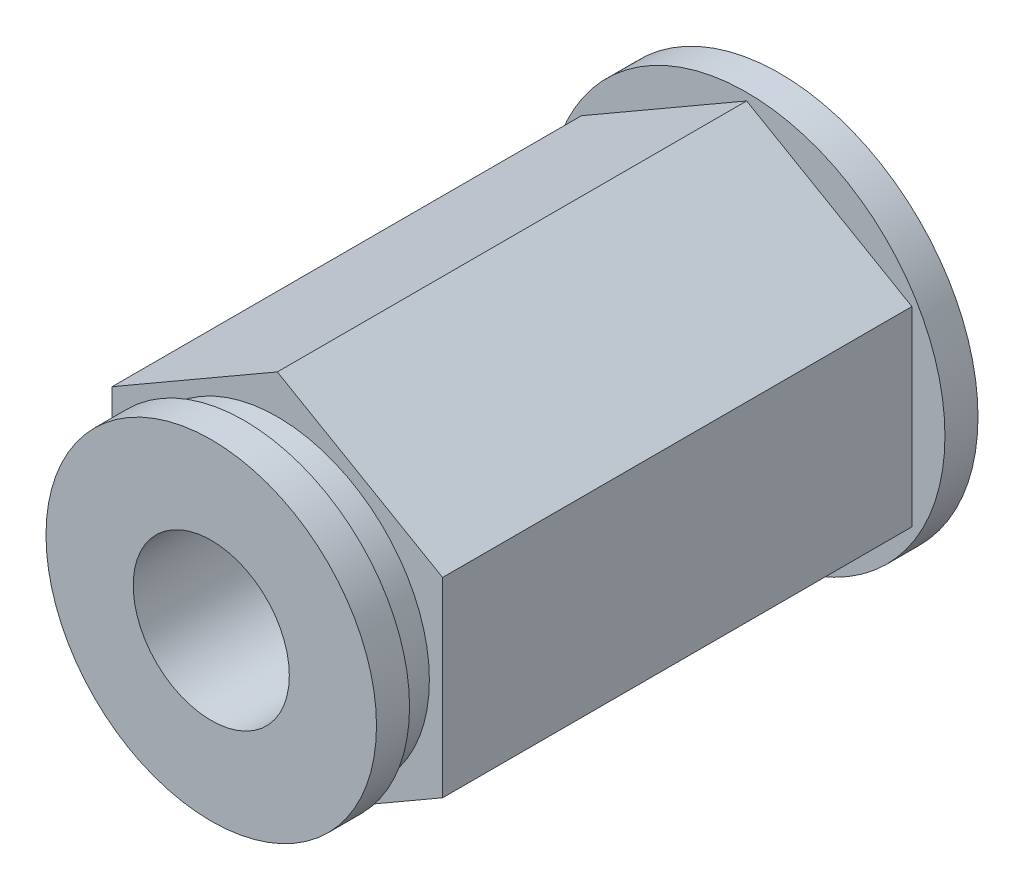
ISO-10303-21;
HEADER;
FILE_DESCRIPTION(('STEP AP214'),'2;1');
FILE_NAME('part.step','',(''),(''),'','','');
FILE_SCHEMA(('AUTOMOTIVE_DESIGN { 1 0 10303 214 1 1 1 1 }'));
ENDSEC;
DATA;
#1=APPLICATION_CONTEXT('core data for automotive mechanical design processes');
#2=APPLICATION_PROTOCOL_DEFINITION('international standard','automotive_design',2000,#1);
#3=PRODUCT_CONTEXT('',#1,'mechanical');
#4=PRODUCT('Part','Part','',(#3));
#5=PRODUCT_RELATED_PRODUCT_CATEGORY('part','',(#4));
#6=PRODUCT_DEFINITION_FORMATION('','',#4);
#7=PRODUCT_DEFINITION_CONTEXT('part definition',#1,'design');
#8=PRODUCT_DEFINITION('design','',#6,#7);
#9=PRODUCT_DEFINITION_SHAPE('','',#8);
#10=(LENGTH_UNIT() NAMED_UNIT(*) SI_UNIT(.MILLI.,.METRE.));
#11=(NAMED_UNIT(*) PLANE_ANGLE_UNIT() SI_UNIT($,.RADIAN.));
#12=(NAMED_UNIT(*) SI_UNIT($,.STERADIAN.) SOLID_ANGLE_UNIT());
#13=UNCERTAINTY_MEASURE_WITH_UNIT(LENGTH_MEASURE(1.E-05),#10,'distance_accuracy_value','');
#14=(GEOMETRIC_REPRESENTATION_CONTEXT(3) GLOBAL_UNCERTAINTY_ASSIGNED_CONTEXT((#13)) GLOBAL_UNIT_ASSIGNED_CONTEXT((#10,
#11,#12)) REPRESENTATION_CONTEXT('',''));
#15=CARTESIAN_POINT('',(0.,0.,0.));
#16=DIRECTION('',(0.,0.,1.));
#17=DIRECTION('',(1.,0.,0.));
#18=AXIS2_PLACEMENT_3D('',#15,#16,#17);
#19=CARTESIAN_POINT('',(0.,0.,0.));
#20=DIRECTION('',(0.,0.,1.));
#21=DIRECTION('',(1.,0.,0.));
#22=AXIS2_PLACEMENT_3D('',#19,#20,#21);
#23=PLANE('',#22);
#24=CARTESIAN_POINT('',(0.,0.,0.));
#25=DIRECTION('',(0.,0.,1.));
#26=DIRECTION('',(1.,0.,0.));
#27=AXIS2_PLACEMENT_3D('',#24,#25,#26);
#28=CIRCLE('',#27,7.62);
#29=CARTESIAN_POINT('',(7.62,0.,0.));
#30=VERTEX_POINT('',#29);
#31=EDGE_CURVE('E145',#30,#30,#28,.T.);
#32=ORIENTED_EDGE('',*,*,#31,.F.);
#33=EDGE_LOOP('',(#32));
#34=FACE_BOUND('',#33,.T.);
#35=CARTESIAN_POINT('',(0.,0.,0.));
#36=DIRECTION('',(0.,0.,1.));
#37=DIRECTION('',(1.,0.,0.));
#38=AXIS2_PLACEMENT_3D('',#35,#36,#37);
#39=CIRCLE('',#38,3.);
#40=CARTESIAN_POINT('',(3.,0.,0.));
#41=VERTEX_POINT('',#40);
#42=EDGE_CURVE('E163',#41,#41,#39,.T.);
#43=ORIENTED_EDGE('',*,*,#42,.T.);
#44=EDGE_LOOP('',(#43));
#45=FACE_BOUND('',#44,.T.);
#46=ADVANCED_FACE('F32',(#34,#45),#23,.F.);
#47=CARTESIAN_POINT('',(0.,0.,21.844));
#48=DIRECTION('',(0.,0.,1.));
#49=DIRECTION('',(1.,0.,0.));
#50=AXIS2_PLACEMENT_3D('',#47,#48,#49);
#51=PLANE('',#50);
#52=CARTESIAN_POINT('',(0.,0.,21.844));
#53=DIRECTION('',(0.,0.,1.));
#54=DIRECTION('',(1.,0.,0.));
#55=AXIS2_PLACEMENT_3D('',#52,#53,#54);
#56=CIRCLE('',#55,6.35);
#57=CARTESIAN_POINT('',(-6.35,0.,21.844));
#58=VERTEX_POINT('',#57);
#59=EDGE_CURVE('E154',#58,#58,#56,.T.);
#60=ORIENTED_EDGE('',*,*,#59,.T.);
#61=EDGE_LOOP('',(#60));
#62=FACE_BOUND('',#61,.T.);
#63=CARTESIAN_POINT('',(0.,0.,21.844));
#64=DIRECTION('',(0.,0.,1.));
#65=DIRECTION('',(1.,0.,0.));
#66=AXIS2_PLACEMENT_3D('',#63,#64,#65);
#67=CIRCLE('',#66,3.);
#68=CARTESIAN_POINT('',(3.,0.,21.844));
#69=VERTEX_POINT('',#68);
#70=EDGE_CURVE('E160',#69,#69,#67,.T.);
#71=ORIENTED_EDGE('',*,*,#70,.F.);
#72=EDGE_LOOP('',(#71));
#73=FACE_BOUND('',#72,.T.);
#74=ADVANCED_FACE('F172',(#62,#73),#51,.T.);
#75=CARTESIAN_POINT('',(0.,0.,19.304));
#76=DIRECTION('',(0.,0.,1.));
#77=DIRECTION('',(1.,0.,0.));
#78=AXIS2_PLACEMENT_3D('',#75,#76,#77);
#79=PLANE('',#78);
#80=DIRECTION('',(-0.866025403784441,0.499999999999995,0.));
#81=VECTOR('',#80,1.);
#82=CARTESIAN_POINT('',(6.34999999999996,3.6661742093542,19.304));
#83=LINE('',#82,#81);
#84=CARTESIAN_POINT('',(6.34999999999996,3.6661742093542,19.304));
#85=VERTEX_POINT('',#84);
#86=CARTESIAN_POINT('',(0.,7.33234841870825,19.304));
#87=VERTEX_POINT('',#86);
#88=EDGE_CURVE('E122',#85,#87,#83,.T.);
#89=ORIENTED_EDGE('',*,*,#88,.T.);
#90=DIRECTION('',(-0.866025403784438,-0.500000000000001,0.));
#91=VECTOR('',#90,1.);
#92=CARTESIAN_POINT('',(0.,7.33234841870825,19.304));
#93=LINE('',#92,#91);
#94=CARTESIAN_POINT('',(-6.35000000000001,3.66617420935411,19.304));
#95=VERTEX_POINT('',#94);
#96=EDGE_CURVE('E119',#87,#95,#93,.T.);
#97=ORIENTED_EDGE('',*,*,#96,.T.);
#98=DIRECTION('',(0.,-1.,0.));
#99=VECTOR('',#98,1.);
#100=CARTESIAN_POINT('',(-6.35000000000001,3.66617420935411,19.304));
#101=LINE('',#100,#99);
#102=CARTESIAN_POINT('',(-6.34999999999999,-3.66617420935416,19.304));
#103=VERTEX_POINT('',#102);
#104=EDGE_CURVE('E130',#95,#103,#101,.T.);
#105=ORIENTED_EDGE('',*,*,#104,.T.);
#106=DIRECTION('',(0.866025403784442,-0.499999999999995,0.));
#107=VECTOR('',#106,1.);
#108=CARTESIAN_POINT('',(-6.34999999999999,-3.66617420935416,19.304));
#109=LINE('',#108,#107);
#110=CARTESIAN_POINT('',(0.,-7.33234841870825,19.304));
#111=VERTEX_POINT('',#110);
#112=EDGE_CURVE('E132',#103,#111,#109,.T.);
#113=ORIENTED_EDGE('',*,*,#112,.T.);
#114=DIRECTION('',(0.866025403784435,0.500000000000007,0.));
#115=VECTOR('',#114,1.);
#116=CARTESIAN_POINT('',(0.,-7.33234841870825,19.304));
#117=LINE('',#116,#115);
#118=CARTESIAN_POINT('',(6.35000000000004,-3.66617420935407,19.304));
#119=VERTEX_POINT('',#118);
#120=EDGE_CURVE('E134',#111,#119,#117,.T.);
#121=ORIENTED_EDGE('',*,*,#120,.T.);
#122=DIRECTION('',(0.,1.,0.));
#123=VECTOR('',#122,1.);
#124=CARTESIAN_POINT('',(6.35000000000004,-3.66617420935407,19.304));
#125=LINE('',#124,#123);
#126=EDGE_CURVE('E54',#119,#85,#125,.T.);
#127=ORIENTED_EDGE('',*,*,#126,.T.);
#128=EDGE_LOOP('',(#89,#97,#105,#113,#121,#127));
#129=FACE_BOUND('',#128,.T.);
#130=CARTESIAN_POINT('',(0.,0.,19.304));
#131=DIRECTION('',(0.,0.,1.));
#132=DIRECTION('',(1.,0.,0.));
#133=AXIS2_PLACEMENT_3D('',#130,#131,#132);
#134=CIRCLE('',#133,5.842);
#135=CARTESIAN_POINT('',(5.842,0.,19.304));
#136=VERTEX_POINT('',#135);
#137=EDGE_CURVE('E151',#136,#136,#134,.T.);
#138=ORIENTED_EDGE('',*,*,#137,.F.);
#139=EDGE_LOOP('',(#138));
#140=FACE_BOUND('',#139,.T.);
#141=ADVANCED_FACE('F135',(#129,#140),#79,.T.);
#142=CARTESIAN_POINT('',(6.34999999999996,3.6661742093542,19.304));
#143=DIRECTION('',(-0.499999999999995,-0.866025403784441,0.));
#144=DIRECTION('',(0.866025403784441,-0.499999999999995,0.));
#145=AXIS2_PLACEMENT_3D('',#142,#143,#144);
#146=PLANE('',#145);
#147=DIRECTION('',(0.,0.,-1.));
#148=VECTOR('',#147,1.);
#149=CARTESIAN_POINT('',(6.34999999999996,3.6661742093542,19.304));
#150=LINE('',#149,#148);
#151=CARTESIAN_POINT('',(6.34999999999996,3.6661742093542,1.27));
#152=VERTEX_POINT('',#151);
#153=EDGE_CURVE('E101',#85,#152,#150,.T.);
#154=ORIENTED_EDGE('',*,*,#153,.T.);
#155=DIRECTION('',(-0.866025403784441,0.499999999999995,0.));
#156=VECTOR('',#155,1.);
#157=CARTESIAN_POINT('',(6.34999999999996,3.6661742093542,1.27));
#158=LINE('',#157,#156);
#159=CARTESIAN_POINT('',(0.,7.33234841870825,1.27));
#160=VERTEX_POINT('',#159);
#161=EDGE_CURVE('E47',#152,#160,#158,.T.);
#162=ORIENTED_EDGE('',*,*,#161,.T.);
#163=DIRECTION('',(0.,0.,-1.));
#164=VECTOR('',#163,1.);
#165=CARTESIAN_POINT('',(0.,7.33234841870825,19.304));
#166=LINE('',#165,#164);
#167=EDGE_CURVE('E40',#87,#160,#166,.T.);
#168=ORIENTED_EDGE('',*,*,#167,.F.);
#169=ORIENTED_EDGE('',*,*,#88,.F.);
#170=EDGE_LOOP('',(#154,#162,#168,#169));
#171=FACE_BOUND('',#170,.T.);
#172=ADVANCED_FACE('F34',(#171),#146,.F.);
#173=CARTESIAN_POINT('',(0.,7.33234841870825,19.304));
#174=DIRECTION('',(0.500000000000001,-0.866025403784438,0.));
#175=DIRECTION('',(0.866025403784438,0.500000000000001,0.));
#176=AXIS2_PLACEMENT_3D('',#173,#174,#175);
#177=PLANE('',#176);
#178=ORIENTED_EDGE('',*,*,#167,.T.);
#179=DIRECTION('',(-0.866025403784438,-0.500000000000001,0.));
#180=VECTOR('',#179,1.);
#181=CARTESIAN_POINT('',(0.,7.33234841870825,1.27));
#182=LINE('',#181,#180);
#183=CARTESIAN_POINT('',(-6.35000000000001,3.66617420935411,1.27));
#184=VERTEX_POINT('',#183);
#185=EDGE_CURVE('E118',#160,#184,#182,.T.);
#186=ORIENTED_EDGE('',*,*,#185,.T.);
#187=DIRECTION('',(0.,0.,-1.));
#188=VECTOR('',#187,1.);
#189=CARTESIAN_POINT('',(-6.35000000000001,3.66617420935411,19.304));
#190=LINE('',#189,#188);
#191=EDGE_CURVE('E110',#95,#184,#190,.T.);
#192=ORIENTED_EDGE('',*,*,#191,.F.);
#193=ORIENTED_EDGE('',*,*,#96,.F.);
#194=EDGE_LOOP('',(#178,#186,#192,#193));
#195=FACE_BOUND('',#194,.T.);
#196=ADVANCED_FACE('F116',(#195),#177,.F.);
#197=CARTESIAN_POINT('',(-6.35000000000001,3.66617420935411,19.304));
#198=DIRECTION('',(1.,0.,0.));
#199=DIRECTION('',(0.,1.,0.));
#200=AXIS2_PLACEMENT_3D('',#197,#198,#199);
#201=PLANE('',#200);
#202=ORIENTED_EDGE('',*,*,#191,.T.);
#203=DIRECTION('',(0.,-1.,0.));
#204=VECTOR('',#203,1.);
#205=CARTESIAN_POINT('',(-6.35000000000001,3.66617420935411,1.27));
#206=LINE('',#205,#204);
#207=CARTESIAN_POINT('',(-6.34999999999999,-3.66617420935416,1.27));
#208=VERTEX_POINT('',#207);
#209=EDGE_CURVE('E125',#184,#208,#206,.T.);
#210=ORIENTED_EDGE('',*,*,#209,.T.);
#211=DIRECTION('',(0.,0.,-1.));
#212=VECTOR('',#211,1.);
#213=CARTESIAN_POINT('',(-6.34999999999999,-3.66617420935416,19.304));
#214=LINE('',#213,#212);
#215=EDGE_CURVE('E103',#103,#208,#214,.T.);
#216=ORIENTED_EDGE('',*,*,#215,.F.);
#217=ORIENTED_EDGE('',*,*,#104,.F.);
#218=EDGE_LOOP('',(#202,#210,#216,#217));
#219=FACE_BOUND('',#218,.T.);
#220=ADVANCED_FACE('F210',(#219),#201,.F.);
#221=CARTESIAN_POINT('',(-6.34999999999999,-3.66617420935416,19.304));
#222=DIRECTION('',(0.499999999999995,0.866025403784442,0.));
#223=DIRECTION('',(-0.866025403784442,0.499999999999995,0.));
#224=AXIS2_PLACEMENT_3D('',#221,#222,#223);
#225=PLANE('',#224);
#226=ORIENTED_EDGE('',*,*,#215,.T.);
#227=DIRECTION('',(0.866025403784442,-0.499999999999995,0.));
#228=VECTOR('',#227,1.);
#229=CARTESIAN_POINT('',(-6.34999999999999,-3.66617420935416,1.27));
#230=LINE('',#229,#228);
#231=CARTESIAN_POINT('',(0.,-7.33234841870825,1.27));
#232=VERTEX_POINT('',#231);
#233=EDGE_CURVE('E97',#208,#232,#230,.T.);
#234=ORIENTED_EDGE('',*,*,#233,.T.);
#235=DIRECTION('',(0.,0.,-1.));
#236=VECTOR('',#235,1.);
#237=CARTESIAN_POINT('',(0.,-7.33234841870825,19.304));
#238=LINE('',#237,#236);
#239=EDGE_CURVE('E96',#111,#232,#238,.T.);
#240=ORIENTED_EDGE('',*,*,#239,.F.);
#241=ORIENTED_EDGE('',*,*,#112,.F.);
#242=EDGE_LOOP('',(#226,#234,#240,#241));
#243=FACE_BOUND('',#242,.T.);
#244=ADVANCED_FACE('F141',(#243),#225,.F.);
#245=CARTESIAN_POINT('',(0.,-7.33234841870825,19.304));
#246=DIRECTION('',(-0.500000000000007,0.866025403784435,0.));
#247=DIRECTION('',(-0.866025403784435,-0.500000000000007,0.));
#248=AXIS2_PLACEMENT_3D('',#245,#246,#247);
#249=PLANE('',#248);
#250=ORIENTED_EDGE('',*,*,#239,.T.);
#251=DIRECTION('',(0.866025403784435,0.500000000000007,0.));
#252=VECTOR('',#251,1.);
#253=CARTESIAN_POINT('',(0.,-7.33234841870825,1.27));
#254=LINE('',#253,#252);
#255=CARTESIAN_POINT('',(6.35000000000004,-3.66617420935407,1.27));
#256=VERTEX_POINT('',#255);
#257=EDGE_CURVE('E84',#232,#256,#254,.T.);
#258=ORIENTED_EDGE('',*,*,#257,.T.);
#259=DIRECTION('',(0.,0.,-1.));
#260=VECTOR('',#259,1.);
#261=CARTESIAN_POINT('',(6.35000000000004,-3.66617420935407,19.304));
#262=LINE('',#261,#260);
#263=EDGE_CURVE('E94',#119,#256,#262,.T.);
#264=ORIENTED_EDGE('',*,*,#263,.F.);
#265=ORIENTED_EDGE('',*,*,#120,.F.);
#266=EDGE_LOOP('',(#250,#258,#264,#265));
#267=FACE_BOUND('',#266,.T.);
#268=ADVANCED_FACE('F92',(#267),#249,.F.);
#269=CARTESIAN_POINT('',(6.35000000000004,-3.66617420935407,19.304));
#270=DIRECTION('',(-1.,0.,0.));
#271=DIRECTION('',(0.,-1.,0.));
#272=AXIS2_PLACEMENT_3D('',#269,#270,#271);
#273=PLANE('',#272);
#274=ORIENTED_EDGE('',*,*,#263,.T.);
#275=DIRECTION('',(0.,1.,0.));
#276=VECTOR('',#275,1.);
#277=CARTESIAN_POINT('',(6.35000000000004,-3.66617420935407,1.27));
#278=LINE('',#277,#276);
#279=EDGE_CURVE('E11',#256,#152,#278,.T.);
#280=ORIENTED_EDGE('',*,*,#279,.T.);
#281=ORIENTED_EDGE('',*,*,#153,.F.);
#282=ORIENTED_EDGE('',*,*,#126,.F.);
#283=EDGE_LOOP('',(#274,#280,#281,#282));
#284=FACE_BOUND('',#283,.T.);
#285=ADVANCED_FACE('F100',(#284),#273,.F.);
#286=CARTESIAN_POINT('',(0.,0.,1.27));
#287=DIRECTION('',(0.,0.,1.));
#288=DIRECTION('',(1.,0.,0.));
#289=AXIS2_PLACEMENT_3D('',#286,#287,#288);
#290=PLANE('',#289);
#291=CARTESIAN_POINT('',(0.,0.,1.27));
#292=DIRECTION('',(0.,0.,1.));
#293=DIRECTION('',(1.,0.,0.));
#294=AXIS2_PLACEMENT_3D('',#291,#292,#293);
#295=CIRCLE('',#294,7.62);
#296=CARTESIAN_POINT('',(7.62,0.,1.27));
#297=VERTEX_POINT('',#296);
#298=EDGE_CURVE('E98',#297,#297,#295,.T.);
#299=ORIENTED_EDGE('',*,*,#298,.T.);
#300=EDGE_LOOP('',(#299));
#301=FACE_BOUND('',#300,.T.);
#302=ORIENTED_EDGE('',*,*,#161,.F.);
#303=ORIENTED_EDGE('',*,*,#279,.F.);
#304=ORIENTED_EDGE('',*,*,#257,.F.);
#305=ORIENTED_EDGE('',*,*,#233,.F.);
#306=ORIENTED_EDGE('',*,*,#209,.F.);
#307=ORIENTED_EDGE('',*,*,#185,.F.);
#308=EDGE_LOOP('',(#302,#303,#304,#305,#306,#307));
#309=FACE_BOUND('',#308,.T.);
#310=ADVANCED_FACE('F83',(#301,#309),#290,.T.);
#311=CARTESIAN_POINT('',(0.,0.,1.27));
#312=DIRECTION('',(0.,0.,-1.));
#313=DIRECTION('',(-1.,0.,0.));
#314=AXIS2_PLACEMENT_3D('',#311,#312,#313);
#315=CYLINDRICAL_SURFACE('',#314,7.62);
#316=ORIENTED_EDGE('',*,*,#298,.F.);
#317=EDGE_LOOP('',(#316));
#318=FACE_BOUND('',#317,.T.);
#319=ORIENTED_EDGE('',*,*,#31,.T.);
#320=EDGE_LOOP('',(#319));
#321=FACE_BOUND('',#320,.T.);
#322=ADVANCED_FACE('F196',(#318,#321),#315,.T.);
#323=CARTESIAN_POINT('',(0.,0.,20.574));
#324=DIRECTION('',(0.,0.,-1.));
#325=DIRECTION('',(-1.,0.,0.));
#326=AXIS2_PLACEMENT_3D('',#323,#324,#325);
#327=CYLINDRICAL_SURFACE('',#326,5.842);
#328=CARTESIAN_POINT('',(0.,0.,20.574));
#329=DIRECTION('',(0.,0.,1.));
#330=DIRECTION('',(1.,0.,0.));
#331=AXIS2_PLACEMENT_3D('',#328,#329,#330);
#332=CIRCLE('',#331,5.842);
#333=CARTESIAN_POINT('',(5.842,0.,20.574));
#334=VERTEX_POINT('',#333);
#335=EDGE_CURVE('E148',#334,#334,#332,.T.);
#336=ORIENTED_EDGE('',*,*,#335,.F.);
#337=EDGE_LOOP('',(#336));
#338=FACE_BOUND('',#337,.T.);
#339=ORIENTED_EDGE('',*,*,#137,.T.);
#340=EDGE_LOOP('',(#339));
#341=FACE_BOUND('',#340,.T.);
#342=ADVANCED_FACE('F189',(#338,#341),#327,.T.);
#343=CARTESIAN_POINT('',(0.,0.,20.574));
#344=DIRECTION('',(0.,0.,1.));
#345=DIRECTION('',(1.,0.,0.));
#346=AXIS2_PLACEMENT_3D('',#343,#344,#345);
#347=PLANE('',#346);
#348=CARTESIAN_POINT('',(0.,0.,20.574));
#349=DIRECTION('',(0.,0.,1.));
#350=DIRECTION('',(1.,0.,0.));
#351=AXIS2_PLACEMENT_3D('',#348,#349,#350);
#352=CIRCLE('',#351,6.35);
#353=CARTESIAN_POINT('',(-6.35,0.,20.574));
#354=VERTEX_POINT('',#353);
#355=EDGE_CURVE('E157',#354,#354,#352,.T.);
#356=ORIENTED_EDGE('',*,*,#355,.F.);
#357=EDGE_LOOP('',(#356));
#358=FACE_BOUND('',#357,.T.);
#359=ORIENTED_EDGE('',*,*,#335,.T.);
#360=EDGE_LOOP('',(#359));
#361=FACE_BOUND('',#360,.T.);
#362=ADVANCED_FACE('F185',(#358,#361),#347,.F.);
#363=CARTESIAN_POINT('',(0.,0.,21.844));
#364=DIRECTION('',(0.,0.,-1.));
#365=DIRECTION('',(-1.,0.,0.));
#366=AXIS2_PLACEMENT_3D('',#363,#364,#365);
#367=CYLINDRICAL_SURFACE('',#366,6.35);
#368=CARTESIAN_POINT('',(-6.35,0.,21.844));
#369=CARTESIAN_POINT('',(-6.35,0.,21.8307708333333));
#370=CARTESIAN_POINT('',(-6.35,0.,21.8175416666667));
#371=CARTESIAN_POINT('',(-6.35,0.,21.7910833333333));
#372=CARTESIAN_POINT('',(-6.35,0.,21.7778541666667));
#373=CARTESIAN_POINT('',(-6.35,0.,21.7513958333333));
#374=CARTESIAN_POINT('',(-6.35,0.,21.7381666666667));
#375=CARTESIAN_POINT('',(-6.35,0.,21.7117083333333));
#376=CARTESIAN_POINT('',(-6.35,0.,21.6984791666667));
#377=CARTESIAN_POINT('',(-6.35,0.,21.6720208333333));
#378=CARTESIAN_POINT('',(-6.35,0.,21.6587916666667));
#379=CARTESIAN_POINT('',(-6.35,0.,21.6323333333333));
#380=CARTESIAN_POINT('',(-6.35,0.,21.6191041666667));
#381=CARTESIAN_POINT('',(-6.35,0.,21.5926458333333));
#382=CARTESIAN_POINT('',(-6.35,0.,21.5794166666667));
#383=CARTESIAN_POINT('',(-6.35,0.,21.5529583333333));
#384=CARTESIAN_POINT('',(-6.35,0.,21.5397291666667));
#385=CARTESIAN_POINT('',(-6.35,0.,21.5132708333333));
#386=CARTESIAN_POINT('',(-6.35,0.,21.5000416666667));
#387=CARTESIAN_POINT('',(-6.35,0.,21.4735833333333));
#388=CARTESIAN_POINT('',(-6.35,0.,21.4603541666667));
#389=CARTESIAN_POINT('',(-6.35,0.,21.4338958333333));
#390=CARTESIAN_POINT('',(-6.35,0.,21.4206666666667));
#391=CARTESIAN_POINT('',(-6.35,0.,21.3942083333333));
#392=CARTESIAN_POINT('',(-6.35,0.,21.3809791666667));
#393=CARTESIAN_POINT('',(-6.35,0.,21.3545208333333));
#394=CARTESIAN_POINT('',(-6.35,0.,21.3412916666667));
#395=CARTESIAN_POINT('',(-6.35,0.,21.3148333333333));
#396=CARTESIAN_POINT('',(-6.35,0.,21.3016041666667));
#397=CARTESIAN_POINT('',(-6.35,0.,21.2751458333333));
#398=CARTESIAN_POINT('',(-6.35,0.,21.2619166666667));
#399=CARTESIAN_POINT('',(-6.35,0.,21.2354583333333));
#400=CARTESIAN_POINT('',(-6.35,0.,21.2222291666667));
#401=CARTESIAN_POINT('',(-6.35,0.,21.1957708333333));
#402=CARTESIAN_POINT('',(-6.35,0.,21.1825416666667));
#403=CARTESIAN_POINT('',(-6.35,0.,21.1560833333333));
#404=CARTESIAN_POINT('',(-6.35,0.,21.1428541666667));
#405=CARTESIAN_POINT('',(-6.35,0.,21.1163958333333));
#406=CARTESIAN_POINT('',(-6.35,0.,21.1031666666667));
#407=CARTESIAN_POINT('',(-6.35,0.,21.0767083333333));
#408=CARTESIAN_POINT('',(-6.35,0.,21.0634791666667));
#409=CARTESIAN_POINT('',(-6.35,0.,21.0370208333333));
#410=CARTESIAN_POINT('',(-6.35,0.,21.0237916666667));
#411=CARTESIAN_POINT('',(-6.35,0.,20.9973333333333));
#412=CARTESIAN_POINT('',(-6.35,0.,20.9841041666667));
#413=CARTESIAN_POINT('',(-6.35,0.,20.9576458333333));
#414=CARTESIAN_POINT('',(-6.35,0.,20.9444166666667));
#415=CARTESIAN_POINT('',(-6.35,0.,20.9179583333333));
#416=CARTESIAN_POINT('',(-6.35,0.,20.9047291666667));
#417=CARTESIAN_POINT('',(-6.35,0.,20.8782708333333));
#418=CARTESIAN_POINT('',(-6.35,0.,20.8650416666667));
#419=CARTESIAN_POINT('',(-6.35,0.,20.8385833333333));
#420=CARTESIAN_POINT('',(-6.35,0.,20.8253541666667));
#421=CARTESIAN_POINT('',(-6.35,0.,20.7988958333333));
#422=CARTESIAN_POINT('',(-6.35,0.,20.7856666666667));
#423=CARTESIAN_POINT('',(-6.35,0.,20.7592083333333));
#424=CARTESIAN_POINT('',(-6.35,0.,20.7459791666667));
#425=CARTESIAN_POINT('',(-6.35,0.,20.7195208333333));
#426=CARTESIAN_POINT('',(-6.35,0.,20.7062916666667));
#427=CARTESIAN_POINT('',(-6.35,0.,20.6798333333333));
#428=CARTESIAN_POINT('',(-6.35,0.,20.6666041666667));
#429=CARTESIAN_POINT('',(-6.35,0.,20.6401458333333));
#430=CARTESIAN_POINT('',(-6.35,0.,20.6269166666667));
#431=CARTESIAN_POINT('',(-6.35,0.,20.6004583333333));
#432=CARTESIAN_POINT('',(-6.35,0.,20.5872291666667));
#433=CARTESIAN_POINT('',(-6.35,0.,20.574));
#434=B_SPLINE_CURVE_WITH_KNOTS('',3,(#368,#369,#370,#371,#372,#373,#374,#375,#376,#377,#378,
#379,#380,#381,#382,#383,#384,#385,#386,#387,#388,#389,#390,#391,#392,#393,#394,#395,#396,#397,
#398,#399,#400,#401,#402,#403,#404,#405,#406,#407,#408,#409,#410,#411,#412,#413,#414,#415,#416,
#417,#418,#419,#420,#421,#422,#423,#424,#425,#426,#427,#428,#429,#430,#431,#432,#433),
.UNSPECIFIED.,.F.,.F.,(4,2,2,2,2,2,2,2,2,2,2,2,2,2,2,2,2,2,2,2,2,2,2,2,2,2,2,2,2,2,2,2,4),(0.,
0.0396874999999998,0.0793749999999996,0.119062499999999,0.158749999999999,0.198437499999999,
0.238124999999999,0.277812499999999,0.317499999999998,0.357187499999998,0.396874999999998,
0.436562499999998,0.476249999999998,0.515937499999997,0.555624999999997,0.595312499999997,
0.634999999999997,0.6746875,0.714375,0.7540625,0.793749999999999,0.833437499999999,
0.873124999999999,0.912812499999999,0.952499999999998,0.992187499999998,1.031875,1.0715625,
1.11125,1.1509375,1.190625,1.2303125,1.27),.UNSPECIFIED.);
#435=EDGE_CURVE('BSEAM188',#58,#354,#434,.T.);
#436=ORIENTED_EDGE('',*,*,#59,.F.);
#437=ORIENTED_EDGE('',*,*,#355,.T.);
#438=ORIENTED_EDGE('',*,*,#435,.T.);
#439=ORIENTED_EDGE('',*,*,#435,.F.);
#440=EDGE_LOOP('',(#436,#438,#437,#439));
#441=FACE_BOUND('',#440,.T.);
#442=ADVANCED_FACE('F188',(#441),#367,.T.);
#443=CARTESIAN_POINT('',(0.,0.,21.844));
#444=DIRECTION('',(0.,0.,-1.));
#445=DIRECTION('',(-1.,0.,0.));
#446=AXIS2_PLACEMENT_3D('',#443,#444,#445);
#447=CYLINDRICAL_SURFACE('',#446,3.);
#448=ORIENTED_EDGE('',*,*,#70,.T.);
#449=EDGE_LOOP('',(#448));
#450=FACE_BOUND('',#449,.T.);
#451=ORIENTED_EDGE('',*,*,#42,.F.);
#452=EDGE_LOOP('',(#451));
#453=FACE_BOUND('',#452,.T.);
#454=ADVANCED_FACE('F169',(#450,#453),#447,.F.);
#455=CLOSED_SHELL('',(#46,#74,#141,#172,#196,#220,#244,#268,#285,#310,#322,#342,#362,#442,#454));
#456=MANIFOLD_SOLID_BREP('B2',#455);
#457=ADVANCED_BREP_SHAPE_REPRESENTATION('',(#18,#456),#14);
#458=SHAPE_DEFINITION_REPRESENTATION(#9,#457);
ENDSEC;
END-ISO-10303-21;
